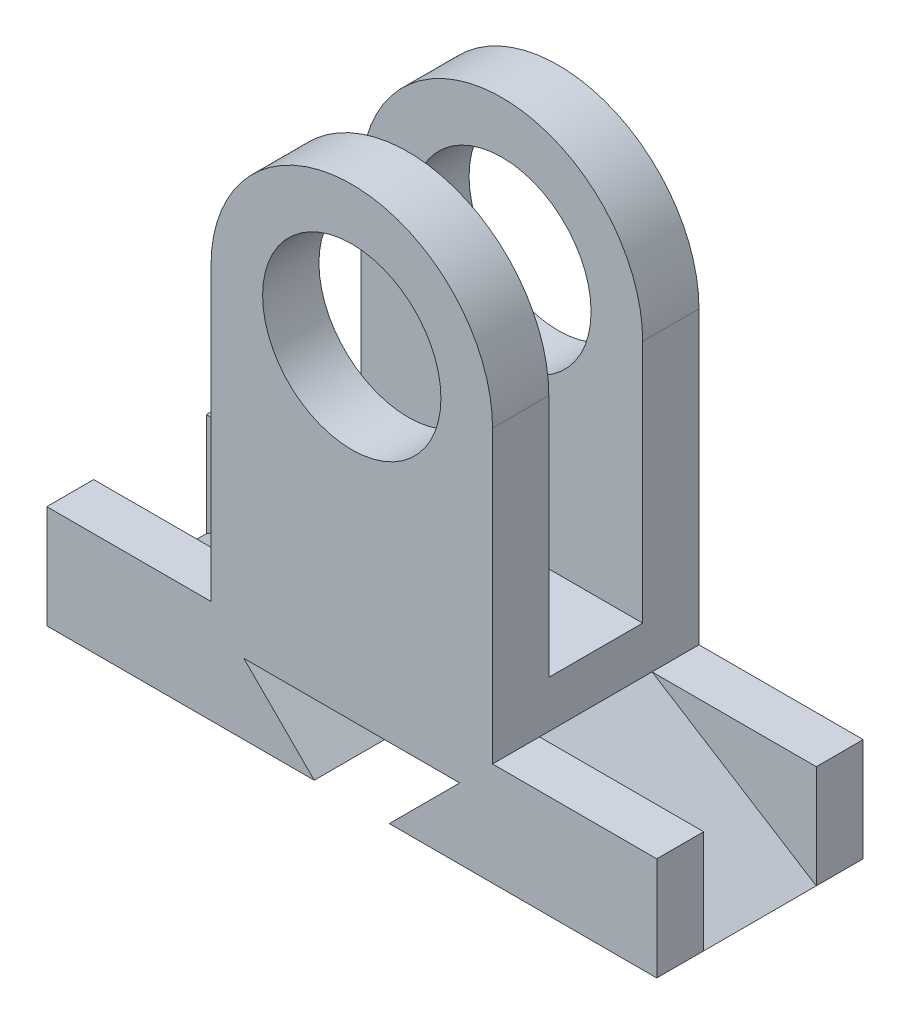
ISO-10303-21;
HEADER;
FILE_DESCRIPTION(('STEP AP214'),'2;1');
FILE_NAME('part.step','',(''),(''),'','','');
FILE_SCHEMA(('AUTOMOTIVE_DESIGN { 1 0 10303 214 1 1 1 1 }'));
ENDSEC;
DATA;
#1=APPLICATION_CONTEXT('core data for automotive mechanical design processes');
#2=APPLICATION_PROTOCOL_DEFINITION('international standard','automotive_design',2000,#1);
#3=PRODUCT_CONTEXT('',#1,'mechanical');
#4=PRODUCT('Part','Part','',(#3));
#5=PRODUCT_RELATED_PRODUCT_CATEGORY('part','',(#4));
#6=PRODUCT_DEFINITION_FORMATION('','',#4);
#7=PRODUCT_DEFINITION_CONTEXT('part definition',#1,'design');
#8=PRODUCT_DEFINITION('design','',#6,#7);
#9=PRODUCT_DEFINITION_SHAPE('','',#8);
#10=(LENGTH_UNIT() NAMED_UNIT(*) SI_UNIT(.MILLI.,.METRE.));
#11=(NAMED_UNIT(*) PLANE_ANGLE_UNIT() SI_UNIT($,.RADIAN.));
#12=(NAMED_UNIT(*) SI_UNIT($,.STERADIAN.) SOLID_ANGLE_UNIT());
#13=UNCERTAINTY_MEASURE_WITH_UNIT(LENGTH_MEASURE(1.E-05),#10,'distance_accuracy_value','');
#14=(GEOMETRIC_REPRESENTATION_CONTEXT(3) GLOBAL_UNCERTAINTY_ASSIGNED_CONTEXT((#13)) GLOBAL_UNIT_ASSIGNED_CONTEXT((#10,
#11,#12)) REPRESENTATION_CONTEXT('',''));
#15=CARTESIAN_POINT('',(0.,0.,0.));
#16=DIRECTION('',(0.,0.,1.));
#17=DIRECTION('',(1.,0.,0.));
#18=AXIS2_PLACEMENT_3D('',#15,#16,#17);
#19=CARTESIAN_POINT('',(0.,22.,-44.));
#20=DIRECTION('',(0.,-1.,0.));
#21=DIRECTION('',(0.,0.,-1.));
#22=AXIS2_PLACEMENT_3D('',#19,#20,#21);
#23=PLANE('',#22);
#24=DIRECTION('',(0.,0.,-1.));
#25=VECTOR('',#24,1.);
#26=CARTESIAN_POINT('',(-14.9027705177202,22.,-32.));
#27=LINE('',#26,#25);
#28=CARTESIAN_POINT('',(-14.9027705177202,22.,-34.));
#29=VERTEX_POINT('',#28);
#30=CARTESIAN_POINT('',(-14.9027705177202,22.,-44.));
#31=VERTEX_POINT('',#30);
#32=EDGE_CURVE('E228',#29,#31,#27,.T.);
#33=ORIENTED_EDGE('',*,*,#32,.T.);
#34=DIRECTION('',(1.,0.,0.));
#35=VECTOR('',#34,1.);
#36=CARTESIAN_POINT('',(0.,22.,-44.));
#37=LINE('',#36,#35);
#38=CARTESIAN_POINT('',(-49.9027705177202,22.,-44.));
#39=VERTEX_POINT('',#38);
#40=EDGE_CURVE('E329',#39,#31,#37,.T.);
#41=ORIENTED_EDGE('',*,*,#40,.F.);
#42=DIRECTION('',(0.,0.,-1.));
#43=VECTOR('',#42,1.);
#44=CARTESIAN_POINT('',(-49.9027705177202,22.,-34.));
#45=LINE('',#44,#43);
#46=CARTESIAN_POINT('',(-49.9027705177202,22.,-34.));
#47=VERTEX_POINT('',#46);
#48=EDGE_CURVE('E258',#47,#39,#45,.T.);
#49=ORIENTED_EDGE('',*,*,#48,.F.);
#50=DIRECTION('',(1.,0.,0.));
#51=VECTOR('',#50,1.);
#52=CARTESIAN_POINT('',(-49.9027705177202,22.,-34.));
#53=LINE('',#52,#51);
#54=EDGE_CURVE('E273',#47,#29,#53,.T.);
#55=ORIENTED_EDGE('',*,*,#54,.T.);
#56=EDGE_LOOP('',(#33,#41,#49,#55));
#57=FACE_BOUND('',#56,.T.);
#58=ADVANCED_FACE('F39',(#57),#23,.F.);
#59=DIRECTION('',(0.,0.,1.));
#60=VECTOR('',#59,1.);
#61=CARTESIAN_POINT('',(-14.9027705177202,22.,-12.));
#62=LINE('',#61,#60);
#63=CARTESIAN_POINT('',(-14.9027705177202,22.,-10.));
#64=VERTEX_POINT('',#63);
#65=CARTESIAN_POINT('',(-14.9027705177202,22.,0.));
#66=VERTEX_POINT('',#65);
#67=EDGE_CURVE('E47',#64,#66,#62,.T.);
#68=ORIENTED_EDGE('',*,*,#67,.F.);
#69=DIRECTION('',(-1.,0.,0.));
#70=VECTOR('',#69,1.);
#71=CARTESIAN_POINT('',(-49.9027705177202,22.,-10.));
#72=LINE('',#71,#70);
#73=CARTESIAN_POINT('',(-49.9027705177202,22.,-10.));
#74=VERTEX_POINT('',#73);
#75=EDGE_CURVE('E303',#64,#74,#72,.T.);
#76=ORIENTED_EDGE('',*,*,#75,.T.);
#77=DIRECTION('',(0.,0.,1.));
#78=VECTOR('',#77,1.);
#79=CARTESIAN_POINT('',(-49.9027705177202,22.,-10.));
#80=LINE('',#79,#78);
#81=CARTESIAN_POINT('',(-49.9027705177202,22.,0.));
#82=VERTEX_POINT('',#81);
#83=EDGE_CURVE('E294',#74,#82,#80,.T.);
#84=ORIENTED_EDGE('',*,*,#83,.T.);
#85=DIRECTION('',(1.,0.,0.));
#86=VECTOR('',#85,1.);
#87=CARTESIAN_POINT('',(0.,22.,0.));
#88=LINE('',#87,#86);
#89=EDGE_CURVE('E348',#82,#66,#88,.T.);
#90=ORIENTED_EDGE('',*,*,#89,.T.);
#91=EDGE_LOOP('',(#68,#76,#84,#90));
#92=FACE_BOUND('',#91,.T.);
#93=ADVANCED_FACE('F406',(#92),#23,.F.);
#94=CARTESIAN_POINT('',(45.0972294822798,22.,-44.));
#95=VERTEX_POINT('',#94);
#96=CARTESIAN_POINT('',(80.0972294822798,22.,-44.));
#97=VERTEX_POINT('',#96);
#98=EDGE_CURVE('E333',#95,#97,#37,.T.);
#99=ORIENTED_EDGE('',*,*,#98,.F.);
#100=DIRECTION('',(0.,0.,-1.));
#101=VECTOR('',#100,1.);
#102=CARTESIAN_POINT('',(45.0972294822798,22.,-32.));
#103=LINE('',#102,#101);
#104=CARTESIAN_POINT('',(45.0972294822798,22.,-34.));
#105=VERTEX_POINT('',#104);
#106=EDGE_CURVE('E225',#105,#95,#103,.T.);
#107=ORIENTED_EDGE('',*,*,#106,.F.);
#108=DIRECTION('',(1.,0.,0.));
#109=VECTOR('',#108,1.);
#110=CARTESIAN_POINT('',(45.0972294822798,22.,-34.));
#111=LINE('',#110,#109);
#112=CARTESIAN_POINT('',(80.0972294822798,22.,-34.));
#113=VERTEX_POINT('',#112);
#114=EDGE_CURVE('E286',#105,#113,#111,.T.);
#115=ORIENTED_EDGE('',*,*,#114,.T.);
#116=DIRECTION('',(0.,0.,-1.));
#117=VECTOR('',#116,1.);
#118=CARTESIAN_POINT('',(80.0972294822798,22.,-34.));
#119=LINE('',#118,#117);
#120=EDGE_CURVE('E289',#113,#97,#119,.T.);
#121=ORIENTED_EDGE('',*,*,#120,.T.);
#122=EDGE_LOOP('',(#99,#107,#115,#121));
#123=FACE_BOUND('',#122,.T.);
#124=ADVANCED_FACE('F431',(#123),#23,.F.);
#125=CARTESIAN_POINT('',(-14.1327916504252,22.4839867165855,-44.));
#126=DIRECTION('',(-0.532171545218346,0.846636549211005,0.));
#127=DIRECTION('',(-0.846636549211005,-0.532171545218346,0.));
#128=AXIS2_PLACEMENT_3D('',#125,#126,#127);
#129=PLANE('',#128);
#130=DIRECTION('',(-0.846636549211005,-0.532171545218346,0.));
#131=VECTOR('',#130,1.);
#132=CARTESIAN_POINT('',(-14.9027705177202,22.,-34.));
#133=LINE('',#132,#131);
#134=CARTESIAN_POINT('',(-49.9027705177202,0.,-34.));
#135=VERTEX_POINT('',#134);
#136=EDGE_CURVE('E276',#29,#135,#133,.T.);
#137=ORIENTED_EDGE('',*,*,#136,.T.);
#138=DIRECTION('',(0.,0.,1.));
#139=VECTOR('',#138,1.);
#140=CARTESIAN_POINT('',(-49.9027705177202,0.,-44.));
#141=LINE('',#140,#139);
#142=CARTESIAN_POINT('',(-49.9027705177202,0.,-10.));
#143=VERTEX_POINT('',#142);
#144=EDGE_CURVE('E347',#135,#143,#141,.T.);
#145=ORIENTED_EDGE('',*,*,#144,.T.);
#146=DIRECTION('',(0.846636549211005,0.532171545218346,0.));
#147=VECTOR('',#146,1.);
#148=CARTESIAN_POINT('',(-14.9027705177202,22.,-10.));
#149=LINE('',#148,#147);
#150=EDGE_CURVE('E297',#143,#64,#149,.T.);
#151=ORIENTED_EDGE('',*,*,#150,.T.);
#152=EDGE_CURVE('E259',#29,#64,#62,.T.);
#153=ORIENTED_EDGE('',*,*,#152,.F.);
#154=EDGE_LOOP('',(#137,#145,#151,#153));
#155=FACE_BOUND('',#154,.T.);
#156=ADVANCED_FACE('F385',(#155),#129,.T.);
#157=DIRECTION('',(-1.,0.,0.));
#158=VECTOR('',#157,1.);
#159=CARTESIAN_POINT('',(80.0972294822798,22.,-10.));
#160=LINE('',#159,#158);
#161=CARTESIAN_POINT('',(80.0972294822798,22.,-10.));
#162=VERTEX_POINT('',#161);
#163=CARTESIAN_POINT('',(45.0972294822798,22.,-10.));
#164=VERTEX_POINT('',#163);
#165=EDGE_CURVE('E311',#162,#164,#160,.T.);
#166=ORIENTED_EDGE('',*,*,#165,.T.);
#167=DIRECTION('',(0.,0.,1.));
#168=VECTOR('',#167,1.);
#169=CARTESIAN_POINT('',(45.0972294822798,22.,-12.));
#170=LINE('',#169,#168);
#171=CARTESIAN_POINT('',(45.0972294822798,22.,0.));
#172=VERTEX_POINT('',#171);
#173=EDGE_CURVE('E260',#164,#172,#170,.T.);
#174=ORIENTED_EDGE('',*,*,#173,.T.);
#175=CARTESIAN_POINT('',(80.0972294822798,22.,0.));
#176=VERTEX_POINT('',#175);
#177=EDGE_CURVE('E326',#172,#176,#88,.T.);
#178=ORIENTED_EDGE('',*,*,#177,.T.);
#179=DIRECTION('',(0.,0.,1.));
#180=VECTOR('',#179,1.);
#181=CARTESIAN_POINT('',(80.0972294822798,22.,-10.));
#182=LINE('',#181,#180);
#183=EDGE_CURVE('E323',#162,#176,#182,.T.);
#184=ORIENTED_EDGE('',*,*,#183,.F.);
#185=EDGE_LOOP('',(#166,#174,#178,#184));
#186=FACE_BOUND('',#185,.T.);
#187=ADVANCED_FACE('F41',(#186),#23,.F.);
#188=CARTESIAN_POINT('',(22.6840603097855,36.0882777655678,-44.));
#189=DIRECTION('',(-0.532171545218345,-0.846636549211005,0.));
#190=DIRECTION('',(0.846636549211005,-0.532171545218345,0.));
#191=AXIS2_PLACEMENT_3D('',#188,#189,#190);
#192=PLANE('',#191);
#193=DIRECTION('',(0.,0.,1.));
#194=VECTOR('',#193,1.);
#195=CARTESIAN_POINT('',(80.0972294822798,0.,-44.));
#196=LINE('',#195,#194);
#197=CARTESIAN_POINT('',(80.0972294822798,0.,-34.));
#198=VERTEX_POINT('',#197);
#199=CARTESIAN_POINT('',(80.0972294822798,0.,-10.));
#200=VERTEX_POINT('',#199);
#201=EDGE_CURVE('E369',#198,#200,#196,.T.);
#202=ORIENTED_EDGE('',*,*,#201,.F.);
#203=DIRECTION('',(-0.846636549211005,0.532171545218345,0.));
#204=VECTOR('',#203,1.);
#205=CARTESIAN_POINT('',(80.0972294822798,0.,-34.));
#206=LINE('',#205,#204);
#207=EDGE_CURVE('E283',#198,#105,#206,.T.);
#208=ORIENTED_EDGE('',*,*,#207,.T.);
#209=EDGE_CURVE('E255',#105,#164,#170,.T.);
#210=ORIENTED_EDGE('',*,*,#209,.T.);
#211=DIRECTION('',(0.846636549211005,-0.532171545218345,0.));
#212=VECTOR('',#211,1.);
#213=CARTESIAN_POINT('',(45.0972294822798,22.,-10.));
#214=LINE('',#213,#212);
#215=EDGE_CURVE('E314',#164,#200,#214,.T.);
#216=ORIENTED_EDGE('',*,*,#215,.T.);
#217=EDGE_LOOP('',(#202,#208,#210,#216));
#218=FACE_BOUND('',#217,.T.);
#219=ADVANCED_FACE('F426',(#218),#192,.F.);
#220=CARTESIAN_POINT('',(0.,0.,-44.));
#221=DIRECTION('',(0.,-1.,0.));
#222=DIRECTION('',(0.,0.,-1.));
#223=AXIS2_PLACEMENT_3D('',#220,#221,#222);
#224=PLANE('',#223);
#225=DIRECTION('',(1.,0.,0.));
#226=VECTOR('',#225,1.);
#227=CARTESIAN_POINT('',(0.,0.,0.));
#228=LINE('',#227,#226);
#229=CARTESIAN_POINT('',(23.0972294822797,0.,0.));
#230=VERTEX_POINT('',#229);
#231=CARTESIAN_POINT('',(80.0972294822798,0.,0.));
#232=VERTEX_POINT('',#231);
#233=EDGE_CURVE('E363',#230,#232,#228,.T.);
#234=ORIENTED_EDGE('',*,*,#233,.F.);
#235=DIRECTION('',(0.,0.,1.));
#236=VECTOR('',#235,1.);
#237=CARTESIAN_POINT('',(23.0972294822797,0.,-44.));
#238=LINE('',#237,#236);
#239=CARTESIAN_POINT('',(23.0972294822797,0.,-44.));
#240=VERTEX_POINT('',#239);
#241=EDGE_CURVE('E370',#240,#230,#238,.T.);
#242=ORIENTED_EDGE('',*,*,#241,.F.);
#243=DIRECTION('',(1.,0.,0.));
#244=VECTOR('',#243,1.);
#245=CARTESIAN_POINT('',(0.,0.,-44.));
#246=LINE('',#245,#244);
#247=CARTESIAN_POINT('',(80.0972294822798,0.,-44.));
#248=VERTEX_POINT('',#247);
#249=EDGE_CURVE('E344',#240,#248,#246,.T.);
#250=ORIENTED_EDGE('',*,*,#249,.T.);
#251=EDGE_CURVE('E366',#248,#198,#196,.T.);
#252=ORIENTED_EDGE('',*,*,#251,.T.);
#253=ORIENTED_EDGE('',*,*,#201,.T.);
#254=DIRECTION('',(0.,0.,1.));
#255=VECTOR('',#254,1.);
#256=CARTESIAN_POINT('',(80.0972294822798,0.,-10.));
#257=LINE('',#256,#255);
#258=EDGE_CURVE('E320',#200,#232,#257,.T.);
#259=ORIENTED_EDGE('',*,*,#258,.T.);
#260=EDGE_LOOP('',(#234,#242,#250,#252,#253,#259));
#261=FACE_BOUND('',#260,.T.);
#262=ADVANCED_FACE('F418',(#261),#224,.T.);
#263=CARTESIAN_POINT('',(11.54861474114,-11.54861474114,-44.));
#264=DIRECTION('',(0.70710678118655,-0.707106781186545,0.));
#265=DIRECTION('',(0.707106781186545,0.70710678118655,0.));
#266=AXIS2_PLACEMENT_3D('',#263,#264,#265);
#267=PLANE('',#266);
#268=DIRECTION('',(0.707106781186545,0.70710678118655,0.));
#269=VECTOR('',#268,1.);
#270=CARTESIAN_POINT('',(11.54861474114,-11.54861474114,0.));
#271=LINE('',#270,#269);
#272=CARTESIAN_POINT('',(38.0972294822798,15.,0.));
#273=VERTEX_POINT('',#272);
#274=EDGE_CURVE('E360',#230,#273,#271,.T.);
#275=ORIENTED_EDGE('',*,*,#274,.T.);
#276=DIRECTION('',(0.,0.,1.));
#277=VECTOR('',#276,1.);
#278=CARTESIAN_POINT('',(38.0972294822798,15.,-44.));
#279=LINE('',#278,#277);
#280=CARTESIAN_POINT('',(38.0972294822798,15.,-44.));
#281=VERTEX_POINT('',#280);
#282=EDGE_CURVE('E372',#281,#273,#279,.T.);
#283=ORIENTED_EDGE('',*,*,#282,.F.);
#284=DIRECTION('',(0.707106781186545,0.70710678118655,0.));
#285=VECTOR('',#284,1.);
#286=CARTESIAN_POINT('',(11.54861474114,-11.54861474114,-44.));
#287=LINE('',#286,#285);
#288=EDGE_CURVE('E342',#240,#281,#287,.T.);
#289=ORIENTED_EDGE('',*,*,#288,.F.);
#290=ORIENTED_EDGE('',*,*,#241,.T.);
#291=EDGE_LOOP('',(#275,#283,#289,#290));
#292=FACE_BOUND('',#291,.T.);
#293=ADVANCED_FACE('F656',(#292),#267,.F.);
#294=CARTESIAN_POINT('',(0.,15.,-44.));
#295=DIRECTION('',(0.,-1.,0.));
#296=DIRECTION('',(1.,0.,0.));
#297=AXIS2_PLACEMENT_3D('',#294,#295,#296);
#298=PLANE('',#297);
#299=DIRECTION('',(1.,0.,0.));
#300=VECTOR('',#299,1.);
#301=CARTESIAN_POINT('',(0.,15.,0.));
#302=LINE('',#301,#300);
#303=CARTESIAN_POINT('',(-7.90277051772015,15.,0.));
#304=VERTEX_POINT('',#303);
#305=EDGE_CURVE('E357',#304,#273,#302,.T.);
#306=ORIENTED_EDGE('',*,*,#305,.F.);
#307=DIRECTION('',(0.,0.,1.));
#308=VECTOR('',#307,1.);
#309=CARTESIAN_POINT('',(-7.90277051772015,15.,-44.));
#310=LINE('',#309,#308);
#311=CARTESIAN_POINT('',(-7.90277051772015,15.,-44.));
#312=VERTEX_POINT('',#311);
#313=EDGE_CURVE('E374',#312,#304,#310,.T.);
#314=ORIENTED_EDGE('',*,*,#313,.F.);
#315=DIRECTION('',(1.,0.,0.));
#316=VECTOR('',#315,1.);
#317=CARTESIAN_POINT('',(0.,15.,-44.));
#318=LINE('',#317,#316);
#319=EDGE_CURVE('E339',#312,#281,#318,.T.);
#320=ORIENTED_EDGE('',*,*,#319,.T.);
#321=ORIENTED_EDGE('',*,*,#282,.T.);
#322=EDGE_LOOP('',(#306,#314,#320,#321));
#323=FACE_BOUND('',#322,.T.);
#324=ADVANCED_FACE('F661',(#323),#298,.T.);
#325=CARTESIAN_POINT('',(3.54861474113995,3.54861474113998,-44.));
#326=DIRECTION('',(0.707106781186545,0.70710678118655,0.));
#327=DIRECTION('',(-0.70710678118655,0.707106781186545,0.));
#328=AXIS2_PLACEMENT_3D('',#325,#326,#327);
#329=PLANE('',#328);
#330=DIRECTION('',(-0.70710678118655,0.707106781186545,0.));
#331=VECTOR('',#330,1.);
#332=CARTESIAN_POINT('',(3.54861474113995,3.54861474113998,0.));
#333=LINE('',#332,#331);
#334=CARTESIAN_POINT('',(7.09722948227995,0.,0.));
#335=VERTEX_POINT('',#334);
#336=EDGE_CURVE('E354',#335,#304,#333,.T.);
#337=ORIENTED_EDGE('',*,*,#336,.F.);
#338=DIRECTION('',(0.,0.,1.));
#339=VECTOR('',#338,1.);
#340=CARTESIAN_POINT('',(7.09722948227995,0.,-44.));
#341=LINE('',#340,#339);
#342=CARTESIAN_POINT('',(7.09722948227995,0.,-44.));
#343=VERTEX_POINT('',#342);
#344=EDGE_CURVE('E376',#343,#335,#341,.T.);
#345=ORIENTED_EDGE('',*,*,#344,.F.);
#346=DIRECTION('',(-0.70710678118655,0.707106781186545,0.));
#347=VECTOR('',#346,1.);
#348=CARTESIAN_POINT('',(3.54861474113995,3.54861474113998,-44.));
#349=LINE('',#348,#347);
#350=EDGE_CURVE('E336',#343,#312,#349,.T.);
#351=ORIENTED_EDGE('',*,*,#350,.T.);
#352=ORIENTED_EDGE('',*,*,#313,.T.);
#353=EDGE_LOOP('',(#337,#345,#351,#352));
#354=FACE_BOUND('',#353,.T.);
#355=ADVANCED_FACE('F749',(#354),#329,.T.);
#356=CARTESIAN_POINT('',(0.,0.,-44.));
#357=DIRECTION('',(0.,-1.,0.));
#358=DIRECTION('',(0.,0.,-1.));
#359=AXIS2_PLACEMENT_3D('',#356,#357,#358);
#360=PLANE('',#359);
#361=DIRECTION('',(1.,0.,0.));
#362=VECTOR('',#361,1.);
#363=CARTESIAN_POINT('',(0.,0.,0.));
#364=LINE('',#363,#362);
#365=CARTESIAN_POINT('',(-49.9027705177202,0.,0.));
#366=VERTEX_POINT('',#365);
#367=EDGE_CURVE('E351',#366,#335,#364,.T.);
#368=ORIENTED_EDGE('',*,*,#367,.F.);
#369=DIRECTION('',(0.,0.,1.));
#370=VECTOR('',#369,1.);
#371=CARTESIAN_POINT('',(-49.9027705177202,0.,-10.));
#372=LINE('',#371,#370);
#373=EDGE_CURVE('E293',#143,#366,#372,.T.);
#374=ORIENTED_EDGE('',*,*,#373,.F.);
#375=ORIENTED_EDGE('',*,*,#144,.F.);
#376=CARTESIAN_POINT('',(-49.9027705177202,0.,-44.));
#377=VERTEX_POINT('',#376);
#378=EDGE_CURVE('E377',#377,#135,#141,.T.);
#379=ORIENTED_EDGE('',*,*,#378,.F.);
#380=DIRECTION('',(1.,0.,0.));
#381=VECTOR('',#380,1.);
#382=CARTESIAN_POINT('',(0.,0.,-44.));
#383=LINE('',#382,#381);
#384=EDGE_CURVE('E332',#377,#343,#383,.T.);
#385=ORIENTED_EDGE('',*,*,#384,.T.);
#386=ORIENTED_EDGE('',*,*,#344,.T.);
#387=EDGE_LOOP('',(#368,#374,#375,#379,#385,#386));
#388=FACE_BOUND('',#387,.T.);
#389=ADVANCED_FACE('F398',(#388),#360,.T.);
#390=CARTESIAN_POINT('',(0.,0.,-44.));
#391=DIRECTION('',(0.,0.,1.));
#392=DIRECTION('',(1.,0.,0.));
#393=AXIS2_PLACEMENT_3D('',#390,#391,#392);
#394=PLANE('',#393);
#395=CARTESIAN_POINT('',(15.0972294822798,84.,-44.));
#396=DIRECTION('',(0.,0.,1.));
#397=DIRECTION('',(1.,0.,0.));
#398=AXIS2_PLACEMENT_3D('',#395,#396,#397);
#399=CIRCLE('',#398,30.);
#400=CARTESIAN_POINT('',(45.0972294822798,84.,-44.));
#401=VERTEX_POINT('',#400);
#402=CARTESIAN_POINT('',(-14.9027705177202,84.,-44.));
#403=VERTEX_POINT('',#402);
#404=EDGE_CURVE('E221',#401,#403,#399,.T.);
#405=ORIENTED_EDGE('',*,*,#404,.F.);
#406=DIRECTION('',(0.,1.,0.));
#407=VECTOR('',#406,1.);
#408=CARTESIAN_POINT('',(45.0972294822798,0.,-44.));
#409=LINE('',#408,#407);
#410=EDGE_CURVE('E219',#95,#401,#409,.T.);
#411=ORIENTED_EDGE('',*,*,#410,.F.);
#412=ORIENTED_EDGE('',*,*,#98,.T.);
#413=DIRECTION('',(0.,-1.,0.));
#414=VECTOR('',#413,1.);
#415=CARTESIAN_POINT('',(80.0972294822798,22.,-44.));
#416=LINE('',#415,#414);
#417=EDGE_CURVE('E272',#97,#248,#416,.T.);
#418=ORIENTED_EDGE('',*,*,#417,.T.);
#419=ORIENTED_EDGE('',*,*,#249,.F.);
#420=ORIENTED_EDGE('',*,*,#288,.T.);
#421=ORIENTED_EDGE('',*,*,#319,.F.);
#422=ORIENTED_EDGE('',*,*,#350,.F.);
#423=ORIENTED_EDGE('',*,*,#384,.F.);
#424=DIRECTION('',(0.,1.,0.));
#425=VECTOR('',#424,1.);
#426=CARTESIAN_POINT('',(-49.9027705177202,0.,-44.));
#427=LINE('',#426,#425);
#428=EDGE_CURVE('E269',#377,#39,#427,.T.);
#429=ORIENTED_EDGE('',*,*,#428,.T.);
#430=ORIENTED_EDGE('',*,*,#40,.T.);
#431=DIRECTION('',(0.,1.,0.));
#432=VECTOR('',#431,1.);
#433=CARTESIAN_POINT('',(-14.9027705177202,0.,-44.));
#434=LINE('',#433,#432);
#435=EDGE_CURVE('E213',#31,#403,#434,.T.);
#436=ORIENTED_EDGE('',*,*,#435,.T.);
#437=EDGE_LOOP('',(#405,#411,#412,#418,#419,#420,#421,#422,#423,#429,#430,#436));
#438=FACE_BOUND('',#437,.T.);
#439=CARTESIAN_POINT('',(15.0972294822798,84.,-44.));
#440=DIRECTION('',(0.,0.,1.));
#441=DIRECTION('',(1.,0.,0.));
#442=AXIS2_PLACEMENT_3D('',#439,#440,#441);
#443=CIRCLE('',#442,19.);
#444=CARTESIAN_POINT('',(34.0972294822799,84.,-44.));
#445=VERTEX_POINT('',#444);
#446=EDGE_CURVE('E211',#445,#445,#443,.T.);
#447=ORIENTED_EDGE('',*,*,#446,.T.);
#448=EDGE_LOOP('',(#447));
#449=FACE_BOUND('',#448,.T.);
#450=ADVANCED_FACE('F441',(#438,#449),#394,.F.);
#451=CARTESIAN_POINT('',(0.,0.,0.));
#452=DIRECTION('',(0.,0.,1.));
#453=DIRECTION('',(1.,0.,0.));
#454=AXIS2_PLACEMENT_3D('',#451,#452,#453);
#455=PLANE('',#454);
#456=CARTESIAN_POINT('',(15.0972294822798,84.,0.));
#457=DIRECTION('',(0.,0.,1.));
#458=DIRECTION('',(1.,0.,0.));
#459=AXIS2_PLACEMENT_3D('',#456,#457,#458);
#460=CIRCLE('',#459,30.);
#461=CARTESIAN_POINT('',(45.0972294822798,84.,0.));
#462=VERTEX_POINT('',#461);
#463=CARTESIAN_POINT('',(-14.9027705177202,84.,0.));
#464=VERTEX_POINT('',#463);
#465=EDGE_CURVE('E251',#462,#464,#460,.T.);
#466=ORIENTED_EDGE('',*,*,#465,.T.);
#467=DIRECTION('',(0.,1.,0.));
#468=VECTOR('',#467,1.);
#469=CARTESIAN_POINT('',(-14.9027705177202,0.,0.));
#470=LINE('',#469,#468);
#471=EDGE_CURVE('E239',#66,#464,#470,.T.);
#472=ORIENTED_EDGE('',*,*,#471,.F.);
#473=ORIENTED_EDGE('',*,*,#89,.F.);
#474=DIRECTION('',(0.,-1.,0.));
#475=VECTOR('',#474,1.);
#476=CARTESIAN_POINT('',(-49.9027705177202,0.,0.));
#477=LINE('',#476,#475);
#478=EDGE_CURVE('E299',#82,#366,#477,.T.);
#479=ORIENTED_EDGE('',*,*,#478,.T.);
#480=ORIENTED_EDGE('',*,*,#367,.T.);
#481=ORIENTED_EDGE('',*,*,#336,.T.);
#482=ORIENTED_EDGE('',*,*,#305,.T.);
#483=ORIENTED_EDGE('',*,*,#274,.F.);
#484=ORIENTED_EDGE('',*,*,#233,.T.);
#485=DIRECTION('',(0.,1.,0.));
#486=VECTOR('',#485,1.);
#487=CARTESIAN_POINT('',(80.0972294822798,0.,0.));
#488=LINE('',#487,#486);
#489=EDGE_CURVE('E302',#232,#176,#488,.T.);
#490=ORIENTED_EDGE('',*,*,#489,.T.);
#491=ORIENTED_EDGE('',*,*,#177,.F.);
#492=DIRECTION('',(0.,1.,0.));
#493=VECTOR('',#492,1.);
#494=CARTESIAN_POINT('',(45.0972294822798,0.,0.));
#495=LINE('',#494,#493);
#496=EDGE_CURVE('E249',#172,#462,#495,.T.);
#497=ORIENTED_EDGE('',*,*,#496,.T.);
#498=EDGE_LOOP('',(#466,#472,#473,#479,#480,#481,#482,#483,#484,#490,#491,#497));
#499=FACE_BOUND('',#498,.T.);
#500=CARTESIAN_POINT('',(15.0972294822798,84.,0.));
#501=DIRECTION('',(0.,0.,1.));
#502=DIRECTION('',(1.,0.,0.));
#503=AXIS2_PLACEMENT_3D('',#500,#501,#502);
#504=CIRCLE('',#503,19.);
#505=CARTESIAN_POINT('',(34.0972294822799,84.,0.));
#506=VERTEX_POINT('',#505);
#507=EDGE_CURVE('E232',#506,#506,#504,.T.);
#508=ORIENTED_EDGE('',*,*,#507,.F.);
#509=EDGE_LOOP('',(#508));
#510=FACE_BOUND('',#509,.T.);
#511=ADVANCED_FACE('F401',(#499,#510),#455,.T.);
#512=CARTESIAN_POINT('',(80.0972294822798,0.,-10.));
#513=DIRECTION('',(1.,0.,0.));
#514=DIRECTION('',(0.,0.,-1.));
#515=AXIS2_PLACEMENT_3D('',#512,#513,#514);
#516=PLANE('',#515);
#517=ORIENTED_EDGE('',*,*,#489,.F.);
#518=ORIENTED_EDGE('',*,*,#258,.F.);
#519=DIRECTION('',(0.,1.,0.));
#520=VECTOR('',#519,1.);
#521=CARTESIAN_POINT('',(80.0972294822798,0.,-10.));
#522=LINE('',#521,#520);
#523=EDGE_CURVE('E317',#200,#162,#522,.T.);
#524=ORIENTED_EDGE('',*,*,#523,.T.);
#525=ORIENTED_EDGE('',*,*,#183,.T.);
#526=EDGE_LOOP('',(#517,#518,#524,#525));
#527=FACE_BOUND('',#526,.T.);
#528=ADVANCED_FACE('F416',(#527),#516,.T.);
#529=CARTESIAN_POINT('',(0.,0.,-10.));
#530=DIRECTION('',(0.,0.,-1.));
#531=DIRECTION('',(-1.,0.,0.));
#532=AXIS2_PLACEMENT_3D('',#529,#530,#531);
#533=PLANE('',#532);
#534=ORIENTED_EDGE('',*,*,#165,.F.);
#535=ORIENTED_EDGE('',*,*,#523,.F.);
#536=ORIENTED_EDGE('',*,*,#215,.F.);
#537=EDGE_LOOP('',(#534,#535,#536));
#538=FACE_BOUND('',#537,.T.);
#539=ADVANCED_FACE('F425',(#538),#533,.T.);
#540=CARTESIAN_POINT('',(-49.9027705177202,0.,-10.));
#541=DIRECTION('',(-1.,0.,0.));
#542=DIRECTION('',(0.,0.,1.));
#543=AXIS2_PLACEMENT_3D('',#540,#541,#542);
#544=PLANE('',#543);
#545=ORIENTED_EDGE('',*,*,#478,.F.);
#546=ORIENTED_EDGE('',*,*,#83,.F.);
#547=DIRECTION('',(0.,-1.,0.));
#548=VECTOR('',#547,1.);
#549=CARTESIAN_POINT('',(-49.9027705177202,0.,-10.));
#550=LINE('',#549,#548);
#551=EDGE_CURVE('E306',#74,#143,#550,.T.);
#552=ORIENTED_EDGE('',*,*,#551,.T.);
#553=ORIENTED_EDGE('',*,*,#373,.T.);
#554=EDGE_LOOP('',(#545,#546,#552,#553));
#555=FACE_BOUND('',#554,.T.);
#556=ADVANCED_FACE('F393',(#555),#544,.T.);
#557=CARTESIAN_POINT('',(0.,0.,-10.));
#558=DIRECTION('',(0.,0.,1.));
#559=DIRECTION('',(1.,0.,0.));
#560=AXIS2_PLACEMENT_3D('',#557,#558,#559);
#561=PLANE('',#560);
#562=ORIENTED_EDGE('',*,*,#75,.F.);
#563=ORIENTED_EDGE('',*,*,#150,.F.);
#564=ORIENTED_EDGE('',*,*,#551,.F.);
#565=EDGE_LOOP('',(#562,#563,#564));
#566=FACE_BOUND('',#565,.T.);
#567=ADVANCED_FACE('F396',(#566),#561,.F.);
#568=CARTESIAN_POINT('',(80.0972294822798,22.,-34.));
#569=DIRECTION('',(1.,0.,0.));
#570=DIRECTION('',(0.,0.,-1.));
#571=AXIS2_PLACEMENT_3D('',#568,#569,#570);
#572=PLANE('',#571);
#573=ORIENTED_EDGE('',*,*,#417,.F.);
#574=ORIENTED_EDGE('',*,*,#120,.F.);
#575=DIRECTION('',(0.,-1.,0.));
#576=VECTOR('',#575,1.);
#577=CARTESIAN_POINT('',(80.0972294822798,22.,-34.));
#578=LINE('',#577,#576);
#579=EDGE_CURVE('E280',#113,#198,#578,.T.);
#580=ORIENTED_EDGE('',*,*,#579,.T.);
#581=ORIENTED_EDGE('',*,*,#251,.F.);
#582=EDGE_LOOP('',(#573,#574,#580,#581));
#583=FACE_BOUND('',#582,.T.);
#584=ADVANCED_FACE('F437',(#583),#572,.T.);
#585=CARTESIAN_POINT('',(0.,0.,-34.));
#586=DIRECTION('',(0.,0.,1.));
#587=DIRECTION('',(1.,0.,0.));
#588=AXIS2_PLACEMENT_3D('',#585,#586,#587);
#589=PLANE('',#588);
#590=ORIENTED_EDGE('',*,*,#579,.F.);
#591=ORIENTED_EDGE('',*,*,#114,.F.);
#592=ORIENTED_EDGE('',*,*,#207,.F.);
#593=EDGE_LOOP('',(#590,#591,#592));
#594=FACE_BOUND('',#593,.T.);
#595=ADVANCED_FACE('F434',(#594),#589,.T.);
#596=CARTESIAN_POINT('',(-49.9027705177202,0.,-34.));
#597=DIRECTION('',(-1.,0.,0.));
#598=DIRECTION('',(0.,0.,1.));
#599=AXIS2_PLACEMENT_3D('',#596,#597,#598);
#600=PLANE('',#599);
#601=ORIENTED_EDGE('',*,*,#428,.F.);
#602=ORIENTED_EDGE('',*,*,#378,.T.);
#603=DIRECTION('',(0.,1.,0.));
#604=VECTOR('',#603,1.);
#605=CARTESIAN_POINT('',(-49.9027705177202,0.,-34.));
#606=LINE('',#605,#604);
#607=EDGE_CURVE('E268',#135,#47,#606,.T.);
#608=ORIENTED_EDGE('',*,*,#607,.T.);
#609=ORIENTED_EDGE('',*,*,#48,.T.);
#610=EDGE_LOOP('',(#601,#602,#608,#609));
#611=FACE_BOUND('',#610,.T.);
#612=ADVANCED_FACE('F720',(#611),#600,.T.);
#613=CARTESIAN_POINT('',(0.,0.,-34.));
#614=DIRECTION('',(0.,0.,1.));
#615=DIRECTION('',(1.,0.,0.));
#616=AXIS2_PLACEMENT_3D('',#613,#614,#615);
#617=PLANE('',#616);
#618=ORIENTED_EDGE('',*,*,#54,.F.);
#619=ORIENTED_EDGE('',*,*,#607,.F.);
#620=ORIENTED_EDGE('',*,*,#136,.F.);
#621=EDGE_LOOP('',(#618,#619,#620));
#622=FACE_BOUND('',#621,.T.);
#623=ADVANCED_FACE('F534',(#622),#617,.T.);
#624=CARTESIAN_POINT('',(45.0972294822798,0.,-12.));
#625=DIRECTION('',(1.,0.,0.));
#626=DIRECTION('',(0.,0.,-1.));
#627=AXIS2_PLACEMENT_3D('',#624,#625,#626);
#628=PLANE('',#627);
#629=DIRECTION('',(0.,0.,1.));
#630=VECTOR('',#629,1.);
#631=CARTESIAN_POINT('',(45.0972294822798,84.,-12.));
#632=LINE('',#631,#630);
#633=CARTESIAN_POINT('',(45.0972294822798,84.,-12.));
#634=VERTEX_POINT('',#633);
#635=EDGE_CURVE('E246',#634,#462,#632,.T.);
#636=ORIENTED_EDGE('',*,*,#635,.T.);
#637=ORIENTED_EDGE('',*,*,#496,.F.);
#638=ORIENTED_EDGE('',*,*,#173,.F.);
#639=ORIENTED_EDGE('',*,*,#209,.F.);
#640=ORIENTED_EDGE('',*,*,#106,.T.);
#641=ORIENTED_EDGE('',*,*,#410,.T.);
#642=DIRECTION('',(0.,0.,-1.));
#643=VECTOR('',#642,1.);
#644=CARTESIAN_POINT('',(45.0972294822798,84.,-32.));
#645=LINE('',#644,#643);
#646=CARTESIAN_POINT('',(45.0972294822798,84.,-32.));
#647=VERTEX_POINT('',#646);
#648=EDGE_CURVE('E192',#647,#401,#645,.T.);
#649=ORIENTED_EDGE('',*,*,#648,.F.);
#650=DIRECTION('',(0.,1.,0.));
#651=VECTOR('',#650,1.);
#652=CARTESIAN_POINT('',(45.0972294822798,0.,-32.));
#653=LINE('',#652,#651);
#654=CARTESIAN_POINT('',(45.0972294822798,32.,-32.));
#655=VERTEX_POINT('',#654);
#656=EDGE_CURVE('E186',#655,#647,#653,.T.);
#657=ORIENTED_EDGE('',*,*,#656,.F.);
#658=DIRECTION('',(0.,0.,1.));
#659=VECTOR('',#658,1.);
#660=CARTESIAN_POINT('',(45.0972294822798,32.,0.));
#661=LINE('',#660,#659);
#662=CARTESIAN_POINT('',(45.0972294822798,32.,-12.));
#663=VERTEX_POINT('',#662);
#664=EDGE_CURVE('E190',#655,#663,#661,.T.);
#665=ORIENTED_EDGE('',*,*,#664,.T.);
#666=DIRECTION('',(0.,1.,0.));
#667=VECTOR('',#666,1.);
#668=CARTESIAN_POINT('',(45.0972294822798,0.,-12.));
#669=LINE('',#668,#667);
#670=EDGE_CURVE('E59',#663,#634,#669,.T.);
#671=ORIENTED_EDGE('',*,*,#670,.T.);
#672=EDGE_LOOP('',(#636,#637,#638,#639,#640,#641,#649,#657,#665,#671));
#673=FACE_BOUND('',#672,.T.);
#674=ADVANCED_FACE('F188',(#673),#628,.T.);
#675=CARTESIAN_POINT('',(-14.9027705177202,0.,-12.));
#676=DIRECTION('',(1.,0.,0.));
#677=DIRECTION('',(0.,0.,-1.));
#678=AXIS2_PLACEMENT_3D('',#675,#676,#677);
#679=PLANE('',#678);
#680=DIRECTION('',(0.,1.,0.));
#681=VECTOR('',#680,1.);
#682=CARTESIAN_POINT('',(-14.9027705177202,0.,-12.));
#683=LINE('',#682,#681);
#684=CARTESIAN_POINT('',(-14.9027705177202,32.,-12.));
#685=VERTEX_POINT('',#684);
#686=CARTESIAN_POINT('',(-14.9027705177202,84.,-12.));
#687=VERTEX_POINT('',#686);
#688=EDGE_CURVE('E244',#685,#687,#683,.T.);
#689=ORIENTED_EDGE('',*,*,#688,.F.);
#690=DIRECTION('',(0.,0.,1.));
#691=VECTOR('',#690,1.);
#692=CARTESIAN_POINT('',(-14.9027705177202,32.,0.));
#693=LINE('',#692,#691);
#694=CARTESIAN_POINT('',(-14.9027705177202,32.,-32.));
#695=VERTEX_POINT('',#694);
#696=EDGE_CURVE('E206',#695,#685,#693,.T.);
#697=ORIENTED_EDGE('',*,*,#696,.F.);
#698=DIRECTION('',(0.,1.,0.));
#699=VECTOR('',#698,1.);
#700=CARTESIAN_POINT('',(-14.9027705177202,0.,-32.));
#701=LINE('',#700,#699);
#702=CARTESIAN_POINT('',(-14.9027705177202,84.,-32.));
#703=VERTEX_POINT('',#702);
#704=EDGE_CURVE('E201',#695,#703,#701,.T.);
#705=ORIENTED_EDGE('',*,*,#704,.T.);
#706=DIRECTION('',(0.,0.,-1.));
#707=VECTOR('',#706,1.);
#708=CARTESIAN_POINT('',(-14.9027705177202,84.,-32.));
#709=LINE('',#708,#707);
#710=EDGE_CURVE('E229',#703,#403,#709,.T.);
#711=ORIENTED_EDGE('',*,*,#710,.T.);
#712=ORIENTED_EDGE('',*,*,#435,.F.);
#713=ORIENTED_EDGE('',*,*,#32,.F.);
#714=ORIENTED_EDGE('',*,*,#152,.T.);
#715=ORIENTED_EDGE('',*,*,#67,.T.);
#716=ORIENTED_EDGE('',*,*,#471,.T.);
#717=DIRECTION('',(0.,0.,1.));
#718=VECTOR('',#717,1.);
#719=CARTESIAN_POINT('',(-14.9027705177202,84.,-12.));
#720=LINE('',#719,#718);
#721=EDGE_CURVE('E262',#687,#464,#720,.T.);
#722=ORIENTED_EDGE('',*,*,#721,.F.);
#723=EDGE_LOOP('',(#689,#697,#705,#711,#712,#713,#714,#715,#716,#722));
#724=FACE_BOUND('',#723,.T.);
#725=ADVANCED_FACE('F446',(#724),#679,.F.);
#726=CARTESIAN_POINT('',(15.0972294822798,84.,-12.));
#727=DIRECTION('',(0.,0.,1.));
#728=DIRECTION('',(1.,0.,0.));
#729=AXIS2_PLACEMENT_3D('',#726,#727,#728);
#730=CYLINDRICAL_SURFACE('',#729,19.);
#731=CARTESIAN_POINT('',(15.0972294822798,84.,-12.));
#732=DIRECTION('',(0.,0.,1.));
#733=DIRECTION('',(1.,0.,0.));
#734=AXIS2_PLACEMENT_3D('',#731,#732,#733);
#735=CIRCLE('',#734,19.);
#736=CARTESIAN_POINT('',(34.0972294822799,84.,-12.));
#737=VERTEX_POINT('',#736);
#738=EDGE_CURVE('E236',#737,#737,#735,.T.);
#739=ORIENTED_EDGE('',*,*,#738,.F.);
#740=EDGE_LOOP('',(#739));
#741=FACE_BOUND('',#740,.T.);
#742=ORIENTED_EDGE('',*,*,#507,.T.);
#743=EDGE_LOOP('',(#742));
#744=FACE_BOUND('',#743,.T.);
#745=ADVANCED_FACE('F455',(#741,#744),#730,.F.);
#746=CARTESIAN_POINT('',(15.0972294822798,84.,-12.));
#747=DIRECTION('',(0.,0.,1.));
#748=DIRECTION('',(1.,0.,0.));
#749=AXIS2_PLACEMENT_3D('',#746,#747,#748);
#750=CYLINDRICAL_SURFACE('',#749,30.);
#751=ORIENTED_EDGE('',*,*,#465,.F.);
#752=ORIENTED_EDGE('',*,*,#635,.F.);
#753=CARTESIAN_POINT('',(15.0972294822798,84.,-12.));
#754=DIRECTION('',(0.,0.,1.));
#755=DIRECTION('',(1.,0.,0.));
#756=AXIS2_PLACEMENT_3D('',#753,#754,#755);
#757=CIRCLE('',#756,30.);
#758=EDGE_CURVE('E241',#634,#687,#757,.T.);
#759=ORIENTED_EDGE('',*,*,#758,.T.);
#760=ORIENTED_EDGE('',*,*,#721,.T.);
#761=EDGE_LOOP('',(#751,#752,#759,#760));
#762=FACE_BOUND('',#761,.T.);
#763=ADVANCED_FACE('F453',(#762),#750,.T.);
#764=CARTESIAN_POINT('',(0.,0.,-12.));
#765=DIRECTION('',(0.,0.,1.));
#766=DIRECTION('',(1.,0.,0.));
#767=AXIS2_PLACEMENT_3D('',#764,#765,#766);
#768=PLANE('',#767);
#769=ORIENTED_EDGE('',*,*,#738,.T.);
#770=EDGE_LOOP('',(#769));
#771=FACE_BOUND('',#770,.T.);
#772=ORIENTED_EDGE('',*,*,#670,.F.);
#773=DIRECTION('',(-1.,0.,0.));
#774=VECTOR('',#773,1.);
#775=CARTESIAN_POINT('',(0.,32.,-12.));
#776=LINE('',#775,#774);
#777=EDGE_CURVE('E54',#663,#685,#776,.T.);
#778=ORIENTED_EDGE('',*,*,#777,.T.);
#779=ORIENTED_EDGE('',*,*,#688,.T.);
#780=ORIENTED_EDGE('',*,*,#758,.F.);
#781=EDGE_LOOP('',(#772,#778,#779,#780));
#782=FACE_BOUND('',#781,.T.);
#783=ADVANCED_FACE('F449',(#771,#782),#768,.F.);
#784=CARTESIAN_POINT('',(15.0972294822798,84.,-32.));
#785=DIRECTION('',(0.,0.,-1.));
#786=DIRECTION('',(1.,0.,0.));
#787=AXIS2_PLACEMENT_3D('',#784,#785,#786);
#788=CYLINDRICAL_SURFACE('',#787,19.);
#789=CARTESIAN_POINT('',(15.0972294822798,84.,-32.));
#790=DIRECTION('',(0.,0.,1.));
#791=DIRECTION('',(1.,0.,0.));
#792=AXIS2_PLACEMENT_3D('',#789,#790,#791);
#793=CIRCLE('',#792,19.);
#794=CARTESIAN_POINT('',(34.0972294822799,84.,-32.));
#795=VERTEX_POINT('',#794);
#796=EDGE_CURVE('E197',#795,#795,#793,.T.);
#797=ORIENTED_EDGE('',*,*,#796,.T.);
#798=EDGE_LOOP('',(#797));
#799=FACE_BOUND('',#798,.T.);
#800=ORIENTED_EDGE('',*,*,#446,.F.);
#801=EDGE_LOOP('',(#800));
#802=FACE_BOUND('',#801,.T.);
#803=ADVANCED_FACE('F461',(#799,#802),#788,.F.);
#804=CARTESIAN_POINT('',(15.0972294822798,84.,-32.));
#805=DIRECTION('',(0.,0.,-1.));
#806=DIRECTION('',(1.,0.,0.));
#807=AXIS2_PLACEMENT_3D('',#804,#805,#806);
#808=CYLINDRICAL_SURFACE('',#807,30.);
#809=ORIENTED_EDGE('',*,*,#404,.T.);
#810=ORIENTED_EDGE('',*,*,#710,.F.);
#811=CARTESIAN_POINT('',(15.0972294822798,84.,-32.));
#812=DIRECTION('',(0.,0.,1.));
#813=DIRECTION('',(1.,0.,0.));
#814=AXIS2_PLACEMENT_3D('',#811,#812,#813);
#815=CIRCLE('',#814,30.);
#816=EDGE_CURVE('E196',#647,#703,#815,.T.);
#817=ORIENTED_EDGE('',*,*,#816,.F.);
#818=ORIENTED_EDGE('',*,*,#648,.T.);
#819=EDGE_LOOP('',(#809,#810,#817,#818));
#820=FACE_BOUND('',#819,.T.);
#821=ADVANCED_FACE('F444',(#820),#808,.T.);
#822=CARTESIAN_POINT('',(0.,0.,-32.));
#823=DIRECTION('',(0.,0.,-1.));
#824=DIRECTION('',(1.,0.,0.));
#825=AXIS2_PLACEMENT_3D('',#822,#823,#824);
#826=PLANE('',#825);
#827=ORIENTED_EDGE('',*,*,#796,.F.);
#828=EDGE_LOOP('',(#827));
#829=FACE_BOUND('',#828,.T.);
#830=ORIENTED_EDGE('',*,*,#704,.F.);
#831=DIRECTION('',(1.,0.,0.));
#832=VECTOR('',#831,1.);
#833=CARTESIAN_POINT('',(0.,32.,-32.));
#834=LINE('',#833,#832);
#835=EDGE_CURVE('E11',#695,#655,#834,.T.);
#836=ORIENTED_EDGE('',*,*,#835,.T.);
#837=ORIENTED_EDGE('',*,*,#656,.T.);
#838=ORIENTED_EDGE('',*,*,#816,.T.);
#839=EDGE_LOOP('',(#830,#836,#837,#838));
#840=FACE_BOUND('',#839,.T.);
#841=ADVANCED_FACE('F200',(#829,#840),#826,.F.);
#842=CARTESIAN_POINT('',(-14.9027705177202,32.,0.));
#843=DIRECTION('',(0.,1.,0.));
#844=DIRECTION('',(0.,0.,1.));
#845=AXIS2_PLACEMENT_3D('',#842,#843,#844);
#846=PLANE('',#845);
#847=ORIENTED_EDGE('',*,*,#777,.F.);
#848=ORIENTED_EDGE('',*,*,#664,.F.);
#849=ORIENTED_EDGE('',*,*,#835,.F.);
#850=ORIENTED_EDGE('',*,*,#696,.T.);
#851=EDGE_LOOP('',(#847,#848,#849,#850));
#852=FACE_BOUND('',#851,.T.);
#853=ADVANCED_FACE('F205',(#852),#846,.T.);
#854=CLOSED_SHELL('',(#58,#93,#124,#156,#187,#219,#262,#293,#324,#355,#389,#450,#511,#528,#539,
#556,#567,#584,#595,#612,#623,#674,#725,#745,#763,#783,#803,#821,#841,#853));
#855=MANIFOLD_SOLID_BREP('B2',#854);
#856=ADVANCED_BREP_SHAPE_REPRESENTATION('',(#18,#855),#14);
#857=SHAPE_DEFINITION_REPRESENTATION(#9,#856);
ENDSEC;
END-ISO-10303-21;
